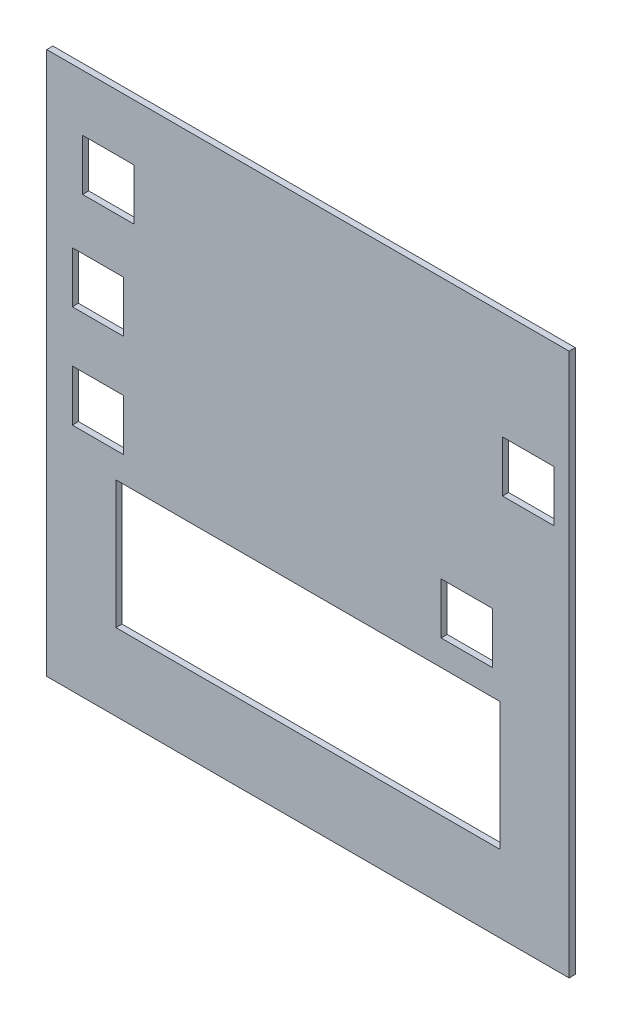
ISO-10303-21;
HEADER;
FILE_DESCRIPTION(('STEP AP214'),'2;1');
FILE_NAME('part.step','',(''),(''),'','','');
FILE_SCHEMA(('AUTOMOTIVE_DESIGN { 1 0 10303 214 1 1 1 1 }'));
ENDSEC;
DATA;
#1=APPLICATION_CONTEXT('core data for automotive mechanical design processes');
#2=APPLICATION_PROTOCOL_DEFINITION('international standard','automotive_design',2000,#1);
#3=PRODUCT_CONTEXT('',#1,'mechanical');
#4=PRODUCT('Part','Part','',(#3));
#5=PRODUCT_RELATED_PRODUCT_CATEGORY('part','',(#4));
#6=PRODUCT_DEFINITION_FORMATION('','',#4);
#7=PRODUCT_DEFINITION_CONTEXT('part definition',#1,'design');
#8=PRODUCT_DEFINITION('design','',#6,#7);
#9=PRODUCT_DEFINITION_SHAPE('','',#8);
#10=(LENGTH_UNIT() NAMED_UNIT(*) SI_UNIT(.MILLI.,.METRE.));
#11=(NAMED_UNIT(*) PLANE_ANGLE_UNIT() SI_UNIT($,.RADIAN.));
#12=(NAMED_UNIT(*) SI_UNIT($,.STERADIAN.) SOLID_ANGLE_UNIT());
#13=UNCERTAINTY_MEASURE_WITH_UNIT(LENGTH_MEASURE(1.E-05),#10,'distance_accuracy_value','');
#14=(GEOMETRIC_REPRESENTATION_CONTEXT(3) GLOBAL_UNCERTAINTY_ASSIGNED_CONTEXT((#13)) GLOBAL_UNIT_ASSIGNED_CONTEXT((#10,
#11,#12)) REPRESENTATION_CONTEXT('',''));
#15=CARTESIAN_POINT('',(0.,0.,0.));
#16=DIRECTION('',(0.,0.,1.));
#17=DIRECTION('',(1.,0.,0.));
#18=AXIS2_PLACEMENT_3D('',#15,#16,#17);
#19=CARTESIAN_POINT('',(0.,0.,1.2));
#20=DIRECTION('',(0.,0.,1.));
#21=DIRECTION('',(1.,0.,0.));
#22=AXIS2_PLACEMENT_3D('',#19,#20,#21);
#23=PLANE('',#22);
#24=DIRECTION('',(0.,1.,0.));
#25=VECTOR('',#24,1.);
#26=CARTESIAN_POINT('',(51.,53.,1.2));
#27=LINE('',#26,#25);
#28=CARTESIAN_POINT('',(51.,-53.,1.2));
#29=VERTEX_POINT('',#28);
#30=CARTESIAN_POINT('',(51.,53.,1.2));
#31=VERTEX_POINT('',#30);
#32=EDGE_CURVE('E395',#29,#31,#27,.T.);
#33=ORIENTED_EDGE('',*,*,#32,.T.);
#34=DIRECTION('',(-1.,0.,0.));
#35=VECTOR('',#34,1.);
#36=CARTESIAN_POINT('',(-51.,53.,1.2));
#37=LINE('',#36,#35);
#38=CARTESIAN_POINT('',(-51.,53.,1.2));
#39=VERTEX_POINT('',#38);
#40=EDGE_CURVE('E398',#31,#39,#37,.T.);
#41=ORIENTED_EDGE('',*,*,#40,.T.);
#42=DIRECTION('',(0.,-1.,0.));
#43=VECTOR('',#42,1.);
#44=CARTESIAN_POINT('',(-51.,53.,1.2));
#45=LINE('',#44,#43);
#46=CARTESIAN_POINT('',(-51.,-53.,1.2));
#47=VERTEX_POINT('',#46);
#48=EDGE_CURVE('E401',#39,#47,#45,.T.);
#49=ORIENTED_EDGE('',*,*,#48,.T.);
#50=DIRECTION('',(1.,0.,0.));
#51=VECTOR('',#50,1.);
#52=CARTESIAN_POINT('',(-51.,-53.,1.2));
#53=LINE('',#52,#51);
#54=EDGE_CURVE('E403',#47,#29,#53,.T.);
#55=ORIENTED_EDGE('',*,*,#54,.T.);
#56=EDGE_LOOP('',(#33,#41,#49,#55));
#57=FACE_BOUND('',#56,.T.);
#58=DIRECTION('',(-1.,0.,0.));
#59=VECTOR('',#58,1.);
#60=CARTESIAN_POINT('',(0.,-38.,1.2));
#61=LINE('',#60,#59);
#62=CARTESIAN_POINT('',(37.5,-38.,1.2));
#63=VERTEX_POINT('',#62);
#64=CARTESIAN_POINT('',(-37.5,-38.,1.2));
#65=VERTEX_POINT('',#64);
#66=EDGE_CURVE('E388',#63,#65,#61,.T.);
#67=ORIENTED_EDGE('',*,*,#66,.T.);
#68=DIRECTION('',(0.,1.,0.));
#69=VECTOR('',#68,1.);
#70=CARTESIAN_POINT('',(-37.5,0.,1.2));
#71=LINE('',#70,#69);
#72=CARTESIAN_POINT('',(-37.5,-13.,1.2));
#73=VERTEX_POINT('',#72);
#74=EDGE_CURVE('E391',#65,#73,#71,.T.);
#75=ORIENTED_EDGE('',*,*,#74,.T.);
#76=DIRECTION('',(1.,0.,0.));
#77=VECTOR('',#76,1.);
#78=CARTESIAN_POINT('',(0.,-13.,1.2));
#79=LINE('',#78,#77);
#80=CARTESIAN_POINT('',(37.5,-13.,1.2));
#81=VERTEX_POINT('',#80);
#82=EDGE_CURVE('E382',#73,#81,#79,.T.);
#83=ORIENTED_EDGE('',*,*,#82,.T.);
#84=DIRECTION('',(0.,-1.,0.));
#85=VECTOR('',#84,1.);
#86=CARTESIAN_POINT('',(37.5,0.,1.2));
#87=LINE('',#86,#85);
#88=EDGE_CURVE('E385',#81,#63,#87,.T.);
#89=ORIENTED_EDGE('',*,*,#88,.T.);
#90=EDGE_LOOP('',(#67,#75,#83,#89));
#91=FACE_BOUND('',#90,.T.);
#92=DIRECTION('',(-1.,0.,0.));
#93=VECTOR('',#92,1.);
#94=CARTESIAN_POINT('',(0.,-7.99999999999998,1.2));
#95=LINE('',#94,#93);
#96=CARTESIAN_POINT('',(-36.,-7.99999999999998,1.2));
#97=VERTEX_POINT('',#96);
#98=CARTESIAN_POINT('',(-46.,-7.99999999999998,1.2));
#99=VERTEX_POINT('',#98);
#100=EDGE_CURVE('E365',#97,#99,#95,.T.);
#101=ORIENTED_EDGE('',*,*,#100,.T.);
#102=DIRECTION('',(0.,1.,0.));
#103=VECTOR('',#102,1.);
#104=CARTESIAN_POINT('',(-46.,0.,1.2));
#105=LINE('',#104,#103);
#106=CARTESIAN_POINT('',(-46.,2.00000000000002,1.2));
#107=VERTEX_POINT('',#106);
#108=EDGE_CURVE('E368',#99,#107,#105,.T.);
#109=ORIENTED_EDGE('',*,*,#108,.T.);
#110=DIRECTION('',(1.,0.,0.));
#111=VECTOR('',#110,1.);
#112=CARTESIAN_POINT('',(0.,2.00000000000002,1.2));
#113=LINE('',#112,#111);
#114=CARTESIAN_POINT('',(-36.,2.00000000000002,1.2));
#115=VERTEX_POINT('',#114);
#116=EDGE_CURVE('E359',#107,#115,#113,.T.);
#117=ORIENTED_EDGE('',*,*,#116,.T.);
#118=DIRECTION('',(0.,-1.,0.));
#119=VECTOR('',#118,1.);
#120=CARTESIAN_POINT('',(-36.,0.,1.2));
#121=LINE('',#120,#119);
#122=EDGE_CURVE('E362',#115,#97,#121,.T.);
#123=ORIENTED_EDGE('',*,*,#122,.T.);
#124=EDGE_LOOP('',(#101,#109,#117,#123));
#125=FACE_BOUND('',#124,.T.);
#126=DIRECTION('',(-1.,0.,0.));
#127=VECTOR('',#126,1.);
#128=CARTESIAN_POINT('',(0.,-7.99999999999999,1.2));
#129=LINE('',#128,#127);
#130=CARTESIAN_POINT('',(36.,-7.99999999999999,1.2));
#131=VERTEX_POINT('',#130);
#132=CARTESIAN_POINT('',(26.,-7.99999999999999,1.2));
#133=VERTEX_POINT('',#132);
#134=EDGE_CURVE('E342',#131,#133,#129,.T.);
#135=ORIENTED_EDGE('',*,*,#134,.T.);
#136=DIRECTION('',(0.,1.,0.));
#137=VECTOR('',#136,1.);
#138=CARTESIAN_POINT('',(26.,0.,1.2));
#139=LINE('',#138,#137);
#140=CARTESIAN_POINT('',(26.,2.00000000000001,1.2));
#141=VERTEX_POINT('',#140);
#142=EDGE_CURVE('E345',#133,#141,#139,.T.);
#143=ORIENTED_EDGE('',*,*,#142,.T.);
#144=DIRECTION('',(1.,0.,0.));
#145=VECTOR('',#144,1.);
#146=CARTESIAN_POINT('',(0.,2.00000000000001,1.2));
#147=LINE('',#146,#145);
#148=CARTESIAN_POINT('',(36.,2.00000000000001,1.2));
#149=VERTEX_POINT('',#148);
#150=EDGE_CURVE('E336',#141,#149,#147,.T.);
#151=ORIENTED_EDGE('',*,*,#150,.T.);
#152=DIRECTION('',(0.,-1.,0.));
#153=VECTOR('',#152,1.);
#154=CARTESIAN_POINT('',(36.,0.,1.2));
#155=LINE('',#154,#153);
#156=EDGE_CURVE('E339',#149,#131,#155,.T.);
#157=ORIENTED_EDGE('',*,*,#156,.T.);
#158=EDGE_LOOP('',(#135,#143,#151,#157));
#159=FACE_BOUND('',#158,.T.);
#160=DIRECTION('',(1.,0.,0.));
#161=VECTOR('',#160,1.);
#162=CARTESIAN_POINT('',(0.,22.,1.2));
#163=LINE('',#162,#161);
#164=CARTESIAN_POINT('',(-46.,22.,1.2));
#165=VERTEX_POINT('',#164);
#166=CARTESIAN_POINT('',(-36.,22.,1.2));
#167=VERTEX_POINT('',#166);
#168=EDGE_CURVE('E319',#165,#167,#163,.T.);
#169=ORIENTED_EDGE('',*,*,#168,.T.);
#170=DIRECTION('',(0.,-1.,0.));
#171=VECTOR('',#170,1.);
#172=CARTESIAN_POINT('',(-36.,0.,1.2));
#173=LINE('',#172,#171);
#174=CARTESIAN_POINT('',(-36.,12.,1.2));
#175=VERTEX_POINT('',#174);
#176=EDGE_CURVE('E322',#167,#175,#173,.T.);
#177=ORIENTED_EDGE('',*,*,#176,.T.);
#178=DIRECTION('',(-1.,0.,0.));
#179=VECTOR('',#178,1.);
#180=CARTESIAN_POINT('',(0.,12.,1.2));
#181=LINE('',#180,#179);
#182=CARTESIAN_POINT('',(-46.,12.,1.2));
#183=VERTEX_POINT('',#182);
#184=EDGE_CURVE('E313',#175,#183,#181,.T.);
#185=ORIENTED_EDGE('',*,*,#184,.T.);
#186=DIRECTION('',(0.,1.,0.));
#187=VECTOR('',#186,1.);
#188=CARTESIAN_POINT('',(-46.,0.,1.2));
#189=LINE('',#188,#187);
#190=EDGE_CURVE('E316',#183,#165,#189,.T.);
#191=ORIENTED_EDGE('',*,*,#190,.T.);
#192=EDGE_LOOP('',(#169,#177,#185,#191));
#193=FACE_BOUND('',#192,.T.);
#194=DIRECTION('',(-1.,0.,0.));
#195=VECTOR('',#194,1.);
#196=CARTESIAN_POINT('',(0.,22.,1.2));
#197=LINE('',#196,#195);
#198=CARTESIAN_POINT('',(48.,22.,1.2));
#199=VERTEX_POINT('',#198);
#200=CARTESIAN_POINT('',(38.,22.,1.2));
#201=VERTEX_POINT('',#200);
#202=EDGE_CURVE('E290',#199,#201,#197,.T.);
#203=ORIENTED_EDGE('',*,*,#202,.T.);
#204=DIRECTION('',(0.,1.,0.));
#205=VECTOR('',#204,1.);
#206=CARTESIAN_POINT('',(38.,0.,1.2));
#207=LINE('',#206,#205);
#208=CARTESIAN_POINT('',(38.,32.,1.2));
#209=VERTEX_POINT('',#208);
#210=EDGE_CURVE('E293',#201,#209,#207,.T.);
#211=ORIENTED_EDGE('',*,*,#210,.T.);
#212=DIRECTION('',(1.,0.,0.));
#213=VECTOR('',#212,1.);
#214=CARTESIAN_POINT('',(0.,32.,1.2));
#215=LINE('',#214,#213);
#216=CARTESIAN_POINT('',(48.,32.,1.2));
#217=VERTEX_POINT('',#216);
#218=EDGE_CURVE('E270',#209,#217,#215,.T.);
#219=ORIENTED_EDGE('',*,*,#218,.T.);
#220=DIRECTION('',(0.,-1.,0.));
#221=VECTOR('',#220,1.);
#222=CARTESIAN_POINT('',(48.,0.,1.2));
#223=LINE('',#222,#221);
#224=EDGE_CURVE('E234',#217,#199,#223,.T.);
#225=ORIENTED_EDGE('',*,*,#224,.T.);
#226=EDGE_LOOP('',(#203,#211,#219,#225));
#227=FACE_BOUND('',#226,.T.);
#228=DIRECTION('',(-1.,0.,0.));
#229=VECTOR('',#228,1.);
#230=CARTESIAN_POINT('',(0.,32.,1.2));
#231=LINE('',#230,#229);
#232=CARTESIAN_POINT('',(-34.,32.,1.2));
#233=VERTEX_POINT('',#232);
#234=CARTESIAN_POINT('',(-44.,32.,1.2));
#235=VERTEX_POINT('',#234);
#236=EDGE_CURVE('E299',#233,#235,#231,.T.);
#237=ORIENTED_EDGE('',*,*,#236,.T.);
#238=DIRECTION('',(0.,1.,0.));
#239=VECTOR('',#238,1.);
#240=CARTESIAN_POINT('',(-44.,0.,1.2));
#241=LINE('',#240,#239);
#242=CARTESIAN_POINT('',(-44.,42.,1.2));
#243=VERTEX_POINT('',#242);
#244=EDGE_CURVE('E269',#235,#243,#241,.T.);
#245=ORIENTED_EDGE('',*,*,#244,.T.);
#246=DIRECTION('',(1.,0.,0.));
#247=VECTOR('',#246,1.);
#248=CARTESIAN_POINT('',(0.,42.,1.2));
#249=LINE('',#248,#247);
#250=CARTESIAN_POINT('',(-34.,42.,1.2));
#251=VERTEX_POINT('',#250);
#252=EDGE_CURVE('E296',#243,#251,#249,.T.);
#253=ORIENTED_EDGE('',*,*,#252,.T.);
#254=DIRECTION('',(0.,-1.,0.));
#255=VECTOR('',#254,1.);
#256=CARTESIAN_POINT('',(-34.,0.,1.2));
#257=LINE('',#256,#255);
#258=EDGE_CURVE('E277',#251,#233,#257,.T.);
#259=ORIENTED_EDGE('',*,*,#258,.T.);
#260=EDGE_LOOP('',(#237,#245,#253,#259));
#261=FACE_BOUND('',#260,.T.);
#262=ADVANCED_FACE('F35',(#57,#91,#125,#159,#193,#227,#261),#23,.T.);
#263=CARTESIAN_POINT('',(0.,0.,0.));
#264=DIRECTION('',(0.,0.,1.));
#265=DIRECTION('',(1.,0.,0.));
#266=AXIS2_PLACEMENT_3D('',#263,#264,#265);
#267=PLANE('',#266);
#268=DIRECTION('',(0.,1.,0.));
#269=VECTOR('',#268,1.);
#270=CARTESIAN_POINT('',(38.,0.,0.));
#271=LINE('',#270,#269);
#272=CARTESIAN_POINT('',(38.,22.,0.));
#273=VERTEX_POINT('',#272);
#274=CARTESIAN_POINT('',(38.,32.,0.));
#275=VERTEX_POINT('',#274);
#276=EDGE_CURVE('E243',#273,#275,#271,.T.);
#277=ORIENTED_EDGE('',*,*,#276,.F.);
#278=DIRECTION('',(-1.,0.,0.));
#279=VECTOR('',#278,1.);
#280=CARTESIAN_POINT('',(0.,22.,0.));
#281=LINE('',#280,#279);
#282=CARTESIAN_POINT('',(48.,22.,0.));
#283=VERTEX_POINT('',#282);
#284=EDGE_CURVE('E241',#283,#273,#281,.T.);
#285=ORIENTED_EDGE('',*,*,#284,.F.);
#286=DIRECTION('',(0.,-1.,0.));
#287=VECTOR('',#286,1.);
#288=CARTESIAN_POINT('',(48.,0.,0.));
#289=LINE('',#288,#287);
#290=CARTESIAN_POINT('',(48.,32.,0.));
#291=VERTEX_POINT('',#290);
#292=EDGE_CURVE('E226',#291,#283,#289,.T.);
#293=ORIENTED_EDGE('',*,*,#292,.F.);
#294=DIRECTION('',(1.,0.,0.));
#295=VECTOR('',#294,1.);
#296=CARTESIAN_POINT('',(0.,32.,0.));
#297=LINE('',#296,#295);
#298=EDGE_CURVE('E218',#275,#291,#297,.T.);
#299=ORIENTED_EDGE('',*,*,#298,.F.);
#300=EDGE_LOOP('',(#277,#285,#293,#299));
#301=FACE_BOUND('',#300,.T.);
#302=DIRECTION('',(0.,1.,0.));
#303=VECTOR('',#302,1.);
#304=CARTESIAN_POINT('',(26.,0.,0.));
#305=LINE('',#304,#303);
#306=CARTESIAN_POINT('',(26.,-7.99999999999999,0.));
#307=VERTEX_POINT('',#306);
#308=CARTESIAN_POINT('',(26.,2.00000000000001,0.));
#309=VERTEX_POINT('',#308);
#310=EDGE_CURVE('E448',#307,#309,#305,.T.);
#311=ORIENTED_EDGE('',*,*,#310,.F.);
#312=DIRECTION('',(-1.,0.,0.));
#313=VECTOR('',#312,1.);
#314=CARTESIAN_POINT('',(0.,-7.99999999999999,0.));
#315=LINE('',#314,#313);
#316=CARTESIAN_POINT('',(36.,-7.99999999999999,0.));
#317=VERTEX_POINT('',#316);
#318=EDGE_CURVE('E446',#317,#307,#315,.T.);
#319=ORIENTED_EDGE('',*,*,#318,.F.);
#320=DIRECTION('',(0.,-1.,0.));
#321=VECTOR('',#320,1.);
#322=CARTESIAN_POINT('',(36.,0.,0.));
#323=LINE('',#322,#321);
#324=CARTESIAN_POINT('',(36.,2.00000000000001,0.));
#325=VERTEX_POINT('',#324);
#326=EDGE_CURVE('E444',#325,#317,#323,.T.);
#327=ORIENTED_EDGE('',*,*,#326,.F.);
#328=DIRECTION('',(1.,0.,0.));
#329=VECTOR('',#328,1.);
#330=CARTESIAN_POINT('',(0.,2.00000000000001,0.));
#331=LINE('',#330,#329);
#332=EDGE_CURVE('E442',#309,#325,#331,.T.);
#333=ORIENTED_EDGE('',*,*,#332,.F.);
#334=EDGE_LOOP('',(#311,#319,#327,#333));
#335=FACE_BOUND('',#334,.T.);
#336=DIRECTION('',(0.,1.,0.));
#337=VECTOR('',#336,1.);
#338=CARTESIAN_POINT('',(-37.5,0.,0.));
#339=LINE('',#338,#337);
#340=CARTESIAN_POINT('',(-37.5,-38.,0.));
#341=VERTEX_POINT('',#340);
#342=CARTESIAN_POINT('',(-37.5,-13.,0.));
#343=VERTEX_POINT('',#342);
#344=EDGE_CURVE('E430',#341,#343,#339,.T.);
#345=ORIENTED_EDGE('',*,*,#344,.F.);
#346=DIRECTION('',(-1.,0.,0.));
#347=VECTOR('',#346,1.);
#348=CARTESIAN_POINT('',(0.,-38.,0.));
#349=LINE('',#348,#347);
#350=CARTESIAN_POINT('',(37.5,-38.,0.));
#351=VERTEX_POINT('',#350);
#352=EDGE_CURVE('E428',#351,#341,#349,.T.);
#353=ORIENTED_EDGE('',*,*,#352,.F.);
#354=DIRECTION('',(0.,-1.,0.));
#355=VECTOR('',#354,1.);
#356=CARTESIAN_POINT('',(37.5,0.,0.));
#357=LINE('',#356,#355);
#358=CARTESIAN_POINT('',(37.5,-13.,0.));
#359=VERTEX_POINT('',#358);
#360=EDGE_CURVE('E426',#359,#351,#357,.T.);
#361=ORIENTED_EDGE('',*,*,#360,.F.);
#362=DIRECTION('',(1.,0.,0.));
#363=VECTOR('',#362,1.);
#364=CARTESIAN_POINT('',(0.,-13.,0.));
#365=LINE('',#364,#363);
#366=EDGE_CURVE('E424',#343,#359,#365,.T.);
#367=ORIENTED_EDGE('',*,*,#366,.F.);
#368=EDGE_LOOP('',(#345,#353,#361,#367));
#369=FACE_BOUND('',#368,.T.);
#370=DIRECTION('',(0.,1.,0.));
#371=VECTOR('',#370,1.);
#372=CARTESIAN_POINT('',(51.,53.,0.));
#373=LINE('',#372,#371);
#374=CARTESIAN_POINT('',(51.,-53.,0.));
#375=VERTEX_POINT('',#374);
#376=CARTESIAN_POINT('',(51.,53.,0.));
#377=VERTEX_POINT('',#376);
#378=EDGE_CURVE('E394',#375,#377,#373,.T.);
#379=ORIENTED_EDGE('',*,*,#378,.F.);
#380=DIRECTION('',(1.,0.,0.));
#381=VECTOR('',#380,1.);
#382=CARTESIAN_POINT('',(-51.,-53.,0.));
#383=LINE('',#382,#381);
#384=CARTESIAN_POINT('',(-51.,-53.,0.));
#385=VERTEX_POINT('',#384);
#386=EDGE_CURVE('E399',#385,#375,#383,.T.);
#387=ORIENTED_EDGE('',*,*,#386,.F.);
#388=DIRECTION('',(0.,-1.,0.));
#389=VECTOR('',#388,1.);
#390=CARTESIAN_POINT('',(-51.,53.,0.));
#391=LINE('',#390,#389);
#392=CARTESIAN_POINT('',(-51.,53.,0.));
#393=VERTEX_POINT('',#392);
#394=EDGE_CURVE('E410',#393,#385,#391,.T.);
#395=ORIENTED_EDGE('',*,*,#394,.F.);
#396=DIRECTION('',(-1.,0.,0.));
#397=VECTOR('',#396,1.);
#398=CARTESIAN_POINT('',(-51.,53.,0.));
#399=LINE('',#398,#397);
#400=EDGE_CURVE('E408',#377,#393,#399,.T.);
#401=ORIENTED_EDGE('',*,*,#400,.F.);
#402=EDGE_LOOP('',(#379,#387,#395,#401));
#403=FACE_BOUND('',#402,.T.);
#404=DIRECTION('',(0.,1.,0.));
#405=VECTOR('',#404,1.);
#406=CARTESIAN_POINT('',(-46.,0.,0.));
#407=LINE('',#406,#405);
#408=CARTESIAN_POINT('',(-46.,-7.99999999999998,0.));
#409=VERTEX_POINT('',#408);
#410=CARTESIAN_POINT('',(-46.,2.00000000000002,0.));
#411=VERTEX_POINT('',#410);
#412=EDGE_CURVE('E439',#409,#411,#407,.T.);
#413=ORIENTED_EDGE('',*,*,#412,.F.);
#414=DIRECTION('',(-1.,0.,0.));
#415=VECTOR('',#414,1.);
#416=CARTESIAN_POINT('',(0.,-7.99999999999998,0.));
#417=LINE('',#416,#415);
#418=CARTESIAN_POINT('',(-36.,-7.99999999999998,0.));
#419=VERTEX_POINT('',#418);
#420=EDGE_CURVE('E437',#419,#409,#417,.T.);
#421=ORIENTED_EDGE('',*,*,#420,.F.);
#422=DIRECTION('',(0.,-1.,0.));
#423=VECTOR('',#422,1.);
#424=CARTESIAN_POINT('',(-36.,0.,0.));
#425=LINE('',#424,#423);
#426=CARTESIAN_POINT('',(-36.,2.00000000000002,0.));
#427=VERTEX_POINT('',#426);
#428=EDGE_CURVE('E435',#427,#419,#425,.T.);
#429=ORIENTED_EDGE('',*,*,#428,.F.);
#430=DIRECTION('',(1.,0.,0.));
#431=VECTOR('',#430,1.);
#432=CARTESIAN_POINT('',(0.,2.00000000000002,0.));
#433=LINE('',#432,#431);
#434=EDGE_CURVE('E433',#411,#427,#433,.T.);
#435=ORIENTED_EDGE('',*,*,#434,.F.);
#436=EDGE_LOOP('',(#413,#421,#429,#435));
#437=FACE_BOUND('',#436,.T.);
#438=DIRECTION('',(0.,-1.,0.));
#439=VECTOR('',#438,1.);
#440=CARTESIAN_POINT('',(-36.,0.,0.));
#441=LINE('',#440,#439);
#442=CARTESIAN_POINT('',(-36.,22.,0.));
#443=VERTEX_POINT('',#442);
#444=CARTESIAN_POINT('',(-36.,12.,0.));
#445=VERTEX_POINT('',#444);
#446=EDGE_CURVE('E227',#443,#445,#441,.T.);
#447=ORIENTED_EDGE('',*,*,#446,.F.);
#448=DIRECTION('',(1.,0.,0.));
#449=VECTOR('',#448,1.);
#450=CARTESIAN_POINT('',(0.,22.,0.));
#451=LINE('',#450,#449);
#452=CARTESIAN_POINT('',(-46.,22.,0.));
#453=VERTEX_POINT('',#452);
#454=EDGE_CURVE('E455',#453,#443,#451,.T.);
#455=ORIENTED_EDGE('',*,*,#454,.F.);
#456=DIRECTION('',(0.,1.,0.));
#457=VECTOR('',#456,1.);
#458=CARTESIAN_POINT('',(-46.,0.,0.));
#459=LINE('',#458,#457);
#460=CARTESIAN_POINT('',(-46.,12.,0.));
#461=VERTEX_POINT('',#460);
#462=EDGE_CURVE('E453',#461,#453,#459,.T.);
#463=ORIENTED_EDGE('',*,*,#462,.F.);
#464=DIRECTION('',(-1.,0.,0.));
#465=VECTOR('',#464,1.);
#466=CARTESIAN_POINT('',(0.,12.,0.));
#467=LINE('',#466,#465);
#468=EDGE_CURVE('E451',#445,#461,#467,.T.);
#469=ORIENTED_EDGE('',*,*,#468,.F.);
#470=EDGE_LOOP('',(#447,#455,#463,#469));
#471=FACE_BOUND('',#470,.T.);
#472=DIRECTION('',(0.,1.,0.));
#473=VECTOR('',#472,1.);
#474=CARTESIAN_POINT('',(-44.,0.,0.));
#475=LINE('',#474,#473);
#476=CARTESIAN_POINT('',(-44.,32.,0.));
#477=VERTEX_POINT('',#476);
#478=CARTESIAN_POINT('',(-44.,42.,0.));
#479=VERTEX_POINT('',#478);
#480=EDGE_CURVE('E11',#477,#479,#475,.T.);
#481=ORIENTED_EDGE('',*,*,#480,.F.);
#482=DIRECTION('',(-1.,0.,0.));
#483=VECTOR('',#482,1.);
#484=CARTESIAN_POINT('',(0.,32.,0.));
#485=LINE('',#484,#483);
#486=CARTESIAN_POINT('',(-34.,32.,0.));
#487=VERTEX_POINT('',#486);
#488=EDGE_CURVE('E43',#487,#477,#485,.T.);
#489=ORIENTED_EDGE('',*,*,#488,.F.);
#490=DIRECTION('',(0.,-1.,0.));
#491=VECTOR('',#490,1.);
#492=CARTESIAN_POINT('',(-34.,0.,0.));
#493=LINE('',#492,#491);
#494=CARTESIAN_POINT('',(-34.,42.,0.));
#495=VERTEX_POINT('',#494);
#496=EDGE_CURVE('E250',#495,#487,#493,.T.);
#497=ORIENTED_EDGE('',*,*,#496,.F.);
#498=DIRECTION('',(1.,0.,0.));
#499=VECTOR('',#498,1.);
#500=CARTESIAN_POINT('',(0.,42.,0.));
#501=LINE('',#500,#499);
#502=EDGE_CURVE('E248',#479,#495,#501,.T.);
#503=ORIENTED_EDGE('',*,*,#502,.F.);
#504=EDGE_LOOP('',(#481,#489,#497,#503));
#505=FACE_BOUND('',#504,.T.);
#506=ADVANCED_FACE('F239',(#301,#335,#369,#403,#437,#471,#505),#267,.F.);
#507=CARTESIAN_POINT('',(51.,53.,1.2));
#508=DIRECTION('',(-1.,0.,0.));
#509=DIRECTION('',(0.,-1.,0.));
#510=AXIS2_PLACEMENT_3D('',#507,#508,#509);
#511=PLANE('',#510);
#512=ORIENTED_EDGE('',*,*,#378,.T.);
#513=DIRECTION('',(0.,0.,-1.));
#514=VECTOR('',#513,1.);
#515=CARTESIAN_POINT('',(51.,53.,1.2));
#516=LINE('',#515,#514);
#517=EDGE_CURVE('E421',#31,#377,#516,.T.);
#518=ORIENTED_EDGE('',*,*,#517,.F.);
#519=ORIENTED_EDGE('',*,*,#32,.F.);
#520=DIRECTION('',(0.,0.,-1.));
#521=VECTOR('',#520,1.);
#522=CARTESIAN_POINT('',(51.,-53.,1.2));
#523=LINE('',#522,#521);
#524=EDGE_CURVE('E405',#29,#375,#523,.T.);
#525=ORIENTED_EDGE('',*,*,#524,.T.);
#526=EDGE_LOOP('',(#512,#518,#519,#525));
#527=FACE_BOUND('',#526,.T.);
#528=ADVANCED_FACE('F37',(#527),#511,.F.);
#529=CARTESIAN_POINT('',(-51.,53.,1.2));
#530=DIRECTION('',(0.,-1.,0.));
#531=DIRECTION('',(0.,0.,-1.));
#532=AXIS2_PLACEMENT_3D('',#529,#530,#531);
#533=PLANE('',#532);
#534=ORIENTED_EDGE('',*,*,#400,.T.);
#535=DIRECTION('',(0.,0.,-1.));
#536=VECTOR('',#535,1.);
#537=CARTESIAN_POINT('',(-51.,53.,1.2));
#538=LINE('',#537,#536);
#539=EDGE_CURVE('E418',#39,#393,#538,.T.);
#540=ORIENTED_EDGE('',*,*,#539,.F.);
#541=ORIENTED_EDGE('',*,*,#40,.F.);
#542=ORIENTED_EDGE('',*,*,#517,.T.);
#543=EDGE_LOOP('',(#534,#540,#541,#542));
#544=FACE_BOUND('',#543,.T.);
#545=ADVANCED_FACE('F503',(#544),#533,.F.);
#546=CARTESIAN_POINT('',(-51.,53.,1.2));
#547=DIRECTION('',(1.,0.,0.));
#548=DIRECTION('',(0.,1.,0.));
#549=AXIS2_PLACEMENT_3D('',#546,#547,#548);
#550=PLANE('',#549);
#551=ORIENTED_EDGE('',*,*,#394,.T.);
#552=DIRECTION('',(0.,0.,-1.));
#553=VECTOR('',#552,1.);
#554=CARTESIAN_POINT('',(-51.,-53.,1.2));
#555=LINE('',#554,#553);
#556=EDGE_CURVE('E415',#47,#385,#555,.T.);
#557=ORIENTED_EDGE('',*,*,#556,.F.);
#558=ORIENTED_EDGE('',*,*,#48,.F.);
#559=ORIENTED_EDGE('',*,*,#539,.T.);
#560=EDGE_LOOP('',(#551,#557,#558,#559));
#561=FACE_BOUND('',#560,.T.);
#562=ADVANCED_FACE('F500',(#561),#550,.F.);
#563=CARTESIAN_POINT('',(-51.,-53.,1.2));
#564=DIRECTION('',(0.,1.,0.));
#565=DIRECTION('',(0.,0.,1.));
#566=AXIS2_PLACEMENT_3D('',#563,#564,#565);
#567=PLANE('',#566);
#568=ORIENTED_EDGE('',*,*,#386,.T.);
#569=ORIENTED_EDGE('',*,*,#524,.F.);
#570=ORIENTED_EDGE('',*,*,#54,.F.);
#571=ORIENTED_EDGE('',*,*,#556,.T.);
#572=EDGE_LOOP('',(#568,#569,#570,#571));
#573=FACE_BOUND('',#572,.T.);
#574=ADVANCED_FACE('F497',(#573),#567,.F.);
#575=CARTESIAN_POINT('',(-37.5,-13.,11.2));
#576=DIRECTION('',(1.,0.,0.));
#577=DIRECTION('',(0.,1.,0.));
#578=AXIS2_PLACEMENT_3D('',#575,#576,#577);
#579=PLANE('',#578);
#580=DIRECTION('',(0.,0.,-1.));
#581=VECTOR('',#580,1.);
#582=CARTESIAN_POINT('',(-37.5,-38.,11.2));
#583=LINE('',#582,#581);
#584=EDGE_CURVE('E379',#65,#341,#583,.T.);
#585=ORIENTED_EDGE('',*,*,#584,.T.);
#586=ORIENTED_EDGE('',*,*,#344,.T.);
#587=DIRECTION('',(0.,0.,-1.));
#588=VECTOR('',#587,1.);
#589=CARTESIAN_POINT('',(-37.5,-13.,11.2));
#590=LINE('',#589,#588);
#591=EDGE_CURVE('E371',#73,#343,#590,.T.);
#592=ORIENTED_EDGE('',*,*,#591,.F.);
#593=ORIENTED_EDGE('',*,*,#74,.F.);
#594=EDGE_LOOP('',(#585,#586,#592,#593));
#595=FACE_BOUND('',#594,.T.);
#596=ADVANCED_FACE('F494',(#595),#579,.T.);
#597=CARTESIAN_POINT('',(37.5,-38.,11.2));
#598=DIRECTION('',(0.,1.,0.));
#599=DIRECTION('',(-1.,0.,0.));
#600=AXIS2_PLACEMENT_3D('',#597,#598,#599);
#601=PLANE('',#600);
#602=DIRECTION('',(0.,0.,-1.));
#603=VECTOR('',#602,1.);
#604=CARTESIAN_POINT('',(37.5,-38.,11.2));
#605=LINE('',#604,#603);
#606=EDGE_CURVE('E376',#63,#351,#605,.T.);
#607=ORIENTED_EDGE('',*,*,#606,.T.);
#608=ORIENTED_EDGE('',*,*,#352,.T.);
#609=ORIENTED_EDGE('',*,*,#584,.F.);
#610=ORIENTED_EDGE('',*,*,#66,.F.);
#611=EDGE_LOOP('',(#607,#608,#609,#610));
#612=FACE_BOUND('',#611,.T.);
#613=ADVANCED_FACE('F564',(#612),#601,.T.);
#614=CARTESIAN_POINT('',(37.5,-13.,11.2));
#615=DIRECTION('',(-1.,0.,0.));
#616=DIRECTION('',(0.,0.,1.));
#617=AXIS2_PLACEMENT_3D('',#614,#615,#616);
#618=PLANE('',#617);
#619=DIRECTION('',(0.,0.,-1.));
#620=VECTOR('',#619,1.);
#621=CARTESIAN_POINT('',(37.5,-13.,11.2));
#622=LINE('',#621,#620);
#623=EDGE_CURVE('E373',#81,#359,#622,.T.);
#624=ORIENTED_EDGE('',*,*,#623,.T.);
#625=ORIENTED_EDGE('',*,*,#360,.T.);
#626=ORIENTED_EDGE('',*,*,#606,.F.);
#627=ORIENTED_EDGE('',*,*,#88,.F.);
#628=EDGE_LOOP('',(#624,#625,#626,#627));
#629=FACE_BOUND('',#628,.T.);
#630=ADVANCED_FACE('F561',(#629),#618,.T.);
#631=CARTESIAN_POINT('',(37.5,-13.,11.2));
#632=DIRECTION('',(0.,-1.,0.));
#633=DIRECTION('',(1.,0.,0.));
#634=AXIS2_PLACEMENT_3D('',#631,#632,#633);
#635=PLANE('',#634);
#636=ORIENTED_EDGE('',*,*,#591,.T.);
#637=ORIENTED_EDGE('',*,*,#366,.T.);
#638=ORIENTED_EDGE('',*,*,#623,.F.);
#639=ORIENTED_EDGE('',*,*,#82,.F.);
#640=EDGE_LOOP('',(#636,#637,#638,#639));
#641=FACE_BOUND('',#640,.T.);
#642=ADVANCED_FACE('F558',(#641),#635,.T.);
#643=CARTESIAN_POINT('',(-46.,-7.99999999999998,11.2));
#644=DIRECTION('',(1.,0.,0.));
#645=DIRECTION('',(0.,0.,-1.));
#646=AXIS2_PLACEMENT_3D('',#643,#644,#645);
#647=PLANE('',#646);
#648=DIRECTION('',(0.,0.,-1.));
#649=VECTOR('',#648,1.);
#650=CARTESIAN_POINT('',(-46.,-7.99999999999998,11.2));
#651=LINE('',#650,#649);
#652=EDGE_CURVE('E356',#99,#409,#651,.T.);
#653=ORIENTED_EDGE('',*,*,#652,.T.);
#654=ORIENTED_EDGE('',*,*,#412,.T.);
#655=DIRECTION('',(0.,0.,-1.));
#656=VECTOR('',#655,1.);
#657=CARTESIAN_POINT('',(-46.,2.00000000000002,11.2));
#658=LINE('',#657,#656);
#659=EDGE_CURVE('E348',#107,#411,#658,.T.);
#660=ORIENTED_EDGE('',*,*,#659,.F.);
#661=ORIENTED_EDGE('',*,*,#108,.F.);
#662=EDGE_LOOP('',(#653,#654,#660,#661));
#663=FACE_BOUND('',#662,.T.);
#664=ADVANCED_FACE('F529',(#663),#647,.T.);
#665=CARTESIAN_POINT('',(-36.,-7.99999999999998,11.2));
#666=DIRECTION('',(0.,1.,0.));
#667=DIRECTION('',(0.,0.,1.));
#668=AXIS2_PLACEMENT_3D('',#665,#666,#667);
#669=PLANE('',#668);
#670=DIRECTION('',(0.,0.,-1.));
#671=VECTOR('',#670,1.);
#672=CARTESIAN_POINT('',(-36.,-7.99999999999998,11.2));
#673=LINE('',#672,#671);
#674=EDGE_CURVE('E353',#97,#419,#673,.T.);
#675=ORIENTED_EDGE('',*,*,#674,.T.);
#676=ORIENTED_EDGE('',*,*,#420,.T.);
#677=ORIENTED_EDGE('',*,*,#652,.F.);
#678=ORIENTED_EDGE('',*,*,#100,.F.);
#679=EDGE_LOOP('',(#675,#676,#677,#678));
#680=FACE_BOUND('',#679,.T.);
#681=ADVANCED_FACE('F532',(#680),#669,.T.);
#682=CARTESIAN_POINT('',(-36.,-7.99999999999998,11.2));
#683=DIRECTION('',(-1.,0.,0.));
#684=DIRECTION('',(0.,0.,1.));
#685=AXIS2_PLACEMENT_3D('',#682,#683,#684);
#686=PLANE('',#685);
#687=DIRECTION('',(0.,0.,-1.));
#688=VECTOR('',#687,1.);
#689=CARTESIAN_POINT('',(-36.,2.00000000000002,11.2));
#690=LINE('',#689,#688);
#691=EDGE_CURVE('E350',#115,#427,#690,.T.);
#692=ORIENTED_EDGE('',*,*,#691,.T.);
#693=ORIENTED_EDGE('',*,*,#428,.T.);
#694=ORIENTED_EDGE('',*,*,#674,.F.);
#695=ORIENTED_EDGE('',*,*,#122,.F.);
#696=EDGE_LOOP('',(#692,#693,#694,#695));
#697=FACE_BOUND('',#696,.T.);
#698=ADVANCED_FACE('F538',(#697),#686,.T.);
#699=CARTESIAN_POINT('',(-36.,2.00000000000002,11.2));
#700=DIRECTION('',(0.,-1.,0.));
#701=DIRECTION('',(1.,0.,0.));
#702=AXIS2_PLACEMENT_3D('',#699,#700,#701);
#703=PLANE('',#702);
#704=ORIENTED_EDGE('',*,*,#659,.T.);
#705=ORIENTED_EDGE('',*,*,#434,.T.);
#706=ORIENTED_EDGE('',*,*,#691,.F.);
#707=ORIENTED_EDGE('',*,*,#116,.F.);
#708=EDGE_LOOP('',(#704,#705,#706,#707));
#709=FACE_BOUND('',#708,.T.);
#710=ADVANCED_FACE('F540',(#709),#703,.T.);
#711=CARTESIAN_POINT('',(26.,-7.99999999999999,11.2));
#712=DIRECTION('',(1.,0.,0.));
#713=DIRECTION('',(0.,0.,-1.));
#714=AXIS2_PLACEMENT_3D('',#711,#712,#713);
#715=PLANE('',#714);
#716=DIRECTION('',(0.,0.,-1.));
#717=VECTOR('',#716,1.);
#718=CARTESIAN_POINT('',(26.,-7.99999999999999,11.2));
#719=LINE('',#718,#717);
#720=EDGE_CURVE('E333',#133,#307,#719,.T.);
#721=ORIENTED_EDGE('',*,*,#720,.T.);
#722=ORIENTED_EDGE('',*,*,#310,.T.);
#723=DIRECTION('',(0.,0.,-1.));
#724=VECTOR('',#723,1.);
#725=CARTESIAN_POINT('',(26.,2.00000000000001,11.2));
#726=LINE('',#725,#724);
#727=EDGE_CURVE('E325',#141,#309,#726,.T.);
#728=ORIENTED_EDGE('',*,*,#727,.F.);
#729=ORIENTED_EDGE('',*,*,#142,.F.);
#730=EDGE_LOOP('',(#721,#722,#728,#729));
#731=FACE_BOUND('',#730,.T.);
#732=ADVANCED_FACE('F542',(#731),#715,.T.);
#733=CARTESIAN_POINT('',(36.,-7.99999999999999,11.2));
#734=DIRECTION('',(0.,1.,0.));
#735=DIRECTION('',(0.,0.,1.));
#736=AXIS2_PLACEMENT_3D('',#733,#734,#735);
#737=PLANE('',#736);
#738=DIRECTION('',(0.,0.,-1.));
#739=VECTOR('',#738,1.);
#740=CARTESIAN_POINT('',(36.,-7.99999999999999,11.2));
#741=LINE('',#740,#739);
#742=EDGE_CURVE('E330',#131,#317,#741,.T.);
#743=ORIENTED_EDGE('',*,*,#742,.T.);
#744=ORIENTED_EDGE('',*,*,#318,.T.);
#745=ORIENTED_EDGE('',*,*,#720,.F.);
#746=ORIENTED_EDGE('',*,*,#134,.F.);
#747=EDGE_LOOP('',(#743,#744,#745,#746));
#748=FACE_BOUND('',#747,.T.);
#749=ADVANCED_FACE('F548',(#748),#737,.T.);
#750=CARTESIAN_POINT('',(36.,-7.99999999999999,11.2));
#751=DIRECTION('',(-1.,0.,0.));
#752=DIRECTION('',(0.,-1.,0.));
#753=AXIS2_PLACEMENT_3D('',#750,#751,#752);
#754=PLANE('',#753);
#755=DIRECTION('',(0.,0.,-1.));
#756=VECTOR('',#755,1.);
#757=CARTESIAN_POINT('',(36.,2.00000000000001,11.2));
#758=LINE('',#757,#756);
#759=EDGE_CURVE('E327',#149,#325,#758,.T.);
#760=ORIENTED_EDGE('',*,*,#759,.T.);
#761=ORIENTED_EDGE('',*,*,#326,.T.);
#762=ORIENTED_EDGE('',*,*,#742,.F.);
#763=ORIENTED_EDGE('',*,*,#156,.F.);
#764=EDGE_LOOP('',(#760,#761,#762,#763));
#765=FACE_BOUND('',#764,.T.);
#766=ADVANCED_FACE('F712',(#765),#754,.T.);
#767=CARTESIAN_POINT('',(36.,2.00000000000001,11.2));
#768=DIRECTION('',(0.,-1.,0.));
#769=DIRECTION('',(1.,0.,0.));
#770=AXIS2_PLACEMENT_3D('',#767,#768,#769);
#771=PLANE('',#770);
#772=ORIENTED_EDGE('',*,*,#727,.T.);
#773=ORIENTED_EDGE('',*,*,#332,.T.);
#774=ORIENTED_EDGE('',*,*,#759,.F.);
#775=ORIENTED_EDGE('',*,*,#150,.F.);
#776=EDGE_LOOP('',(#772,#773,#774,#775));
#777=FACE_BOUND('',#776,.T.);
#778=ADVANCED_FACE('F483',(#777),#771,.T.);
#779=CARTESIAN_POINT('',(-36.,22.,11.2));
#780=DIRECTION('',(-1.,0.,0.));
#781=DIRECTION('',(0.,0.,1.));
#782=AXIS2_PLACEMENT_3D('',#779,#780,#781);
#783=PLANE('',#782);
#784=DIRECTION('',(0.,0.,-1.));
#785=VECTOR('',#784,1.);
#786=CARTESIAN_POINT('',(-36.,22.,11.2));
#787=LINE('',#786,#785);
#788=EDGE_CURVE('E310',#167,#443,#787,.T.);
#789=ORIENTED_EDGE('',*,*,#788,.T.);
#790=ORIENTED_EDGE('',*,*,#446,.T.);
#791=DIRECTION('',(0.,0.,-1.));
#792=VECTOR('',#791,1.);
#793=CARTESIAN_POINT('',(-36.,12.,11.2));
#794=LINE('',#793,#792);
#795=EDGE_CURVE('E302',#175,#445,#794,.T.);
#796=ORIENTED_EDGE('',*,*,#795,.F.);
#797=ORIENTED_EDGE('',*,*,#176,.F.);
#798=EDGE_LOOP('',(#789,#790,#796,#797));
#799=FACE_BOUND('',#798,.T.);
#800=ADVANCED_FACE('F461',(#799),#783,.T.);
#801=CARTESIAN_POINT('',(-46.,22.,11.2));
#802=DIRECTION('',(0.,-1.,0.));
#803=DIRECTION('',(0.,0.,-1.));
#804=AXIS2_PLACEMENT_3D('',#801,#802,#803);
#805=PLANE('',#804);
#806=DIRECTION('',(0.,0.,-1.));
#807=VECTOR('',#806,1.);
#808=CARTESIAN_POINT('',(-46.,22.,11.2));
#809=LINE('',#808,#807);
#810=EDGE_CURVE('E307',#165,#453,#809,.T.);
#811=ORIENTED_EDGE('',*,*,#810,.T.);
#812=ORIENTED_EDGE('',*,*,#454,.T.);
#813=ORIENTED_EDGE('',*,*,#788,.F.);
#814=ORIENTED_EDGE('',*,*,#168,.F.);
#815=EDGE_LOOP('',(#811,#812,#813,#814));
#816=FACE_BOUND('',#815,.T.);
#817=ADVANCED_FACE('F475',(#816),#805,.T.);
#818=CARTESIAN_POINT('',(-46.,22.,11.2));
#819=DIRECTION('',(1.,0.,0.));
#820=DIRECTION('',(0.,0.,-1.));
#821=AXIS2_PLACEMENT_3D('',#818,#819,#820);
#822=PLANE('',#821);
#823=DIRECTION('',(0.,0.,-1.));
#824=VECTOR('',#823,1.);
#825=CARTESIAN_POINT('',(-46.,12.,11.2));
#826=LINE('',#825,#824);
#827=EDGE_CURVE('E304',#183,#461,#826,.T.);
#828=ORIENTED_EDGE('',*,*,#827,.T.);
#829=ORIENTED_EDGE('',*,*,#462,.T.);
#830=ORIENTED_EDGE('',*,*,#810,.F.);
#831=ORIENTED_EDGE('',*,*,#190,.F.);
#832=EDGE_LOOP('',(#828,#829,#830,#831));
#833=FACE_BOUND('',#832,.T.);
#834=ADVANCED_FACE('F470',(#833),#822,.T.);
#835=CARTESIAN_POINT('',(-46.,12.,11.2));
#836=DIRECTION('',(0.,1.,0.));
#837=DIRECTION('',(0.,0.,1.));
#838=AXIS2_PLACEMENT_3D('',#835,#836,#837);
#839=PLANE('',#838);
#840=ORIENTED_EDGE('',*,*,#795,.T.);
#841=ORIENTED_EDGE('',*,*,#468,.T.);
#842=ORIENTED_EDGE('',*,*,#827,.F.);
#843=ORIENTED_EDGE('',*,*,#184,.F.);
#844=EDGE_LOOP('',(#840,#841,#842,#843));
#845=FACE_BOUND('',#844,.T.);
#846=ADVANCED_FACE('F467',(#845),#839,.T.);
#847=CARTESIAN_POINT('',(38.,22.,11.2));
#848=DIRECTION('',(1.,0.,0.));
#849=DIRECTION('',(0.,0.,-1.));
#850=AXIS2_PLACEMENT_3D('',#847,#848,#849);
#851=PLANE('',#850);
#852=DIRECTION('',(0.,0.,-1.));
#853=VECTOR('',#852,1.);
#854=CARTESIAN_POINT('',(38.,22.,11.2));
#855=LINE('',#854,#853);
#856=EDGE_CURVE('E281',#201,#273,#855,.T.);
#857=ORIENTED_EDGE('',*,*,#856,.T.);
#858=ORIENTED_EDGE('',*,*,#276,.T.);
#859=DIRECTION('',(0.,0.,-1.));
#860=VECTOR('',#859,1.);
#861=CARTESIAN_POINT('',(38.,32.,11.2));
#862=LINE('',#861,#860);
#863=EDGE_CURVE('E221',#209,#275,#862,.T.);
#864=ORIENTED_EDGE('',*,*,#863,.F.);
#865=ORIENTED_EDGE('',*,*,#210,.F.);
#866=EDGE_LOOP('',(#857,#858,#864,#865));
#867=FACE_BOUND('',#866,.T.);
#868=ADVANCED_FACE('F637',(#867),#851,.T.);
#869=CARTESIAN_POINT('',(48.,22.,11.2));
#870=DIRECTION('',(0.,1.,0.));
#871=DIRECTION('',(-1.,0.,0.));
#872=AXIS2_PLACEMENT_3D('',#869,#870,#871);
#873=PLANE('',#872);
#874=DIRECTION('',(0.,0.,-1.));
#875=VECTOR('',#874,1.);
#876=CARTESIAN_POINT('',(48.,22.,11.2));
#877=LINE('',#876,#875);
#878=EDGE_CURVE('E236',#199,#283,#877,.T.);
#879=ORIENTED_EDGE('',*,*,#878,.T.);
#880=ORIENTED_EDGE('',*,*,#284,.T.);
#881=ORIENTED_EDGE('',*,*,#856,.F.);
#882=ORIENTED_EDGE('',*,*,#202,.F.);
#883=EDGE_LOOP('',(#879,#880,#881,#882));
#884=FACE_BOUND('',#883,.T.);
#885=ADVANCED_FACE('F646',(#884),#873,.T.);
#886=CARTESIAN_POINT('',(48.,22.,11.2));
#887=DIRECTION('',(-1.,0.,0.));
#888=DIRECTION('',(0.,0.,1.));
#889=AXIS2_PLACEMENT_3D('',#886,#887,#888);
#890=PLANE('',#889);
#891=DIRECTION('',(0.,0.,-1.));
#892=VECTOR('',#891,1.);
#893=CARTESIAN_POINT('',(48.,32.,11.2));
#894=LINE('',#893,#892);
#895=EDGE_CURVE('E58',#217,#291,#894,.T.);
#896=ORIENTED_EDGE('',*,*,#895,.T.);
#897=ORIENTED_EDGE('',*,*,#292,.T.);
#898=ORIENTED_EDGE('',*,*,#878,.F.);
#899=ORIENTED_EDGE('',*,*,#224,.F.);
#900=EDGE_LOOP('',(#896,#897,#898,#899));
#901=FACE_BOUND('',#900,.T.);
#902=ADVANCED_FACE('F230',(#901),#890,.T.);
#903=CARTESIAN_POINT('',(48.,32.,11.2));
#904=DIRECTION('',(0.,-1.,0.));
#905=DIRECTION('',(0.,0.,-1.));
#906=AXIS2_PLACEMENT_3D('',#903,#904,#905);
#907=PLANE('',#906);
#908=ORIENTED_EDGE('',*,*,#863,.T.);
#909=ORIENTED_EDGE('',*,*,#298,.T.);
#910=ORIENTED_EDGE('',*,*,#895,.F.);
#911=ORIENTED_EDGE('',*,*,#218,.F.);
#912=EDGE_LOOP('',(#908,#909,#910,#911));
#913=FACE_BOUND('',#912,.T.);
#914=ADVANCED_FACE('F219',(#913),#907,.T.);
#915=CARTESIAN_POINT('',(-44.,32.,11.2));
#916=DIRECTION('',(1.,0.,0.));
#917=DIRECTION('',(0.,0.,-1.));
#918=AXIS2_PLACEMENT_3D('',#915,#916,#917);
#919=PLANE('',#918);
#920=DIRECTION('',(0.,0.,-1.));
#921=VECTOR('',#920,1.);
#922=CARTESIAN_POINT('',(-44.,32.,11.2));
#923=LINE('',#922,#921);
#924=EDGE_CURVE('E257',#235,#477,#923,.T.);
#925=ORIENTED_EDGE('',*,*,#924,.T.);
#926=ORIENTED_EDGE('',*,*,#480,.T.);
#927=DIRECTION('',(0.,0.,-1.));
#928=VECTOR('',#927,1.);
#929=CARTESIAN_POINT('',(-44.,42.,11.2));
#930=LINE('',#929,#928);
#931=EDGE_CURVE('E273',#243,#479,#930,.T.);
#932=ORIENTED_EDGE('',*,*,#931,.F.);
#933=ORIENTED_EDGE('',*,*,#244,.F.);
#934=EDGE_LOOP('',(#925,#926,#932,#933));
#935=FACE_BOUND('',#934,.T.);
#936=ADVANCED_FACE('F265',(#935),#919,.T.);
#937=CARTESIAN_POINT('',(-34.,32.,11.2));
#938=DIRECTION('',(0.,1.,0.));
#939=DIRECTION('',(0.,0.,1.));
#940=AXIS2_PLACEMENT_3D('',#937,#938,#939);
#941=PLANE('',#940);
#942=DIRECTION('',(0.,0.,-1.));
#943=VECTOR('',#942,1.);
#944=CARTESIAN_POINT('',(-34.,32.,11.2));
#945=LINE('',#944,#943);
#946=EDGE_CURVE('E260',#233,#487,#945,.T.);
#947=ORIENTED_EDGE('',*,*,#946,.T.);
#948=ORIENTED_EDGE('',*,*,#488,.T.);
#949=ORIENTED_EDGE('',*,*,#924,.F.);
#950=ORIENTED_EDGE('',*,*,#236,.F.);
#951=EDGE_LOOP('',(#947,#948,#949,#950));
#952=FACE_BOUND('',#951,.T.);
#953=ADVANCED_FACE('F256',(#952),#941,.T.);
#954=CARTESIAN_POINT('',(-34.,32.,11.2));
#955=DIRECTION('',(-1.,0.,0.));
#956=DIRECTION('',(0.,0.,1.));
#957=AXIS2_PLACEMENT_3D('',#954,#955,#956);
#958=PLANE('',#957);
#959=DIRECTION('',(0.,0.,-1.));
#960=VECTOR('',#959,1.);
#961=CARTESIAN_POINT('',(-34.,42.,11.2));
#962=LINE('',#961,#960);
#963=EDGE_CURVE('E50',#251,#495,#962,.T.);
#964=ORIENTED_EDGE('',*,*,#963,.T.);
#965=ORIENTED_EDGE('',*,*,#496,.T.);
#966=ORIENTED_EDGE('',*,*,#946,.F.);
#967=ORIENTED_EDGE('',*,*,#258,.F.);
#968=EDGE_LOOP('',(#964,#965,#966,#967));
#969=FACE_BOUND('',#968,.T.);
#970=ADVANCED_FACE('F275',(#969),#958,.T.);
#971=CARTESIAN_POINT('',(-34.,42.,11.2));
#972=DIRECTION('',(0.,-1.,0.));
#973=DIRECTION('',(0.,0.,-1.));
#974=AXIS2_PLACEMENT_3D('',#971,#972,#973);
#975=PLANE('',#974);
#976=ORIENTED_EDGE('',*,*,#931,.T.);
#977=ORIENTED_EDGE('',*,*,#502,.T.);
#978=ORIENTED_EDGE('',*,*,#963,.F.);
#979=ORIENTED_EDGE('',*,*,#252,.F.);
#980=EDGE_LOOP('',(#976,#977,#978,#979));
#981=FACE_BOUND('',#980,.T.);
#982=ADVANCED_FACE('F272',(#981),#975,.T.);
#983=CLOSED_SHELL('',(#262,#506,#528,#545,#562,#574,#596,#613,#630,#642,#664,#681,#698,#710,
#732,#749,#766,#778,#800,#817,#834,#846,#868,#885,#902,#914,#936,#953,#970,#982));
#984=MANIFOLD_SOLID_BREP('B2',#983);
#985=ADVANCED_BREP_SHAPE_REPRESENTATION('',(#18,#984),#14);
#986=SHAPE_DEFINITION_REPRESENTATION(#9,#985);
ENDSEC;
END-ISO-10303-21;
